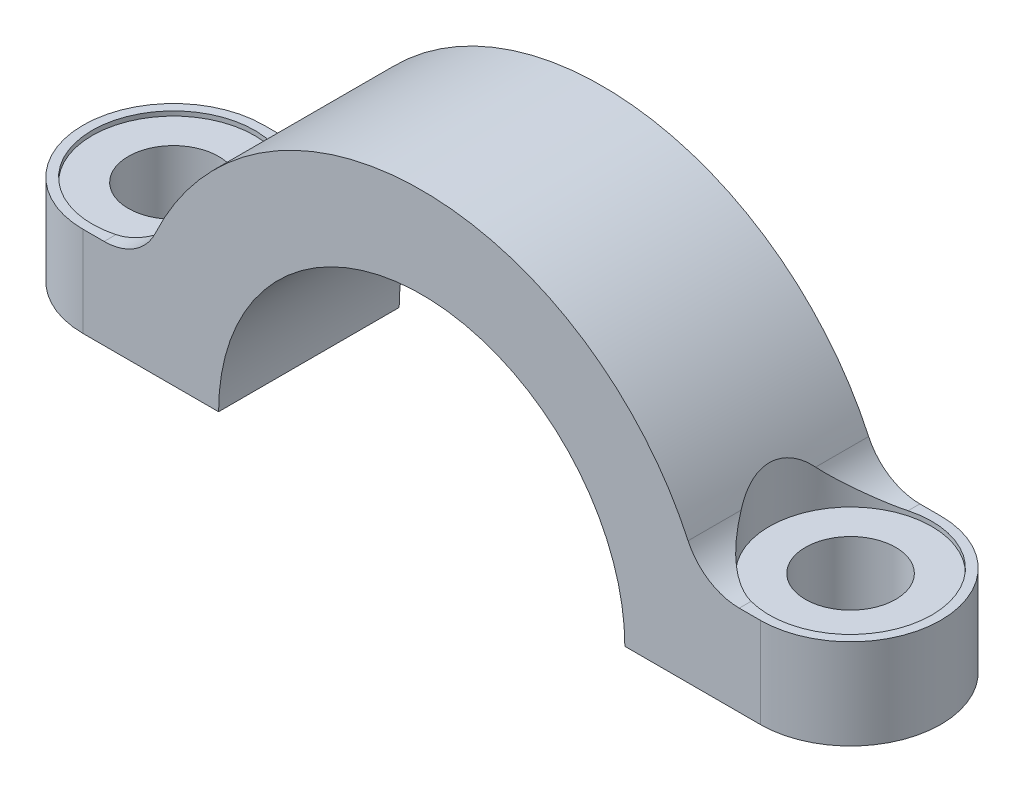
ISO-10303-21;
HEADER;
FILE_DESCRIPTION(('STEP AP214'),'2;1');
FILE_NAME('part.step','',(''),(''),'','','');
FILE_SCHEMA(('AUTOMOTIVE_DESIGN { 1 0 10303 214 1 1 1 1 }'));
ENDSEC;
DATA;
#1=APPLICATION_CONTEXT('core data for automotive mechanical design processes');
#2=APPLICATION_PROTOCOL_DEFINITION('international standard','automotive_design',2000,#1);
#3=PRODUCT_CONTEXT('',#1,'mechanical');
#4=PRODUCT('Part','Part','',(#3));
#5=PRODUCT_RELATED_PRODUCT_CATEGORY('part','',(#4));
#6=PRODUCT_DEFINITION_FORMATION('','',#4);
#7=PRODUCT_DEFINITION_CONTEXT('part definition',#1,'design');
#8=PRODUCT_DEFINITION('design','',#6,#7);
#9=PRODUCT_DEFINITION_SHAPE('','',#8);
#10=(LENGTH_UNIT() NAMED_UNIT(*) SI_UNIT(.MILLI.,.METRE.));
#11=(NAMED_UNIT(*) PLANE_ANGLE_UNIT() SI_UNIT($,.RADIAN.));
#12=(NAMED_UNIT(*) SI_UNIT($,.STERADIAN.) SOLID_ANGLE_UNIT());
#13=UNCERTAINTY_MEASURE_WITH_UNIT(LENGTH_MEASURE(1.E-05),#10,'distance_accuracy_value','');
#14=(GEOMETRIC_REPRESENTATION_CONTEXT(3) GLOBAL_UNCERTAINTY_ASSIGNED_CONTEXT((#13)) GLOBAL_UNIT_ASSIGNED_CONTEXT((#10,
#11,#12)) REPRESENTATION_CONTEXT('',''));
#15=CARTESIAN_POINT('',(0.,0.,0.));
#16=DIRECTION('',(0.,0.,1.));
#17=DIRECTION('',(1.,0.,0.));
#18=AXIS2_PLACEMENT_3D('',#15,#16,#17);
#19=CARTESIAN_POINT('',(14.0712472794703,6.5,4.));
#20=DIRECTION('',(0.,0.,-1.));
#21=DIRECTION('',(-1.,0.,0.));
#22=AXIS2_PLACEMENT_3D('',#19,#20,#21);
#23=CYLINDRICAL_SURFACE('',#22,2.5);
#24=CARTESIAN_POINT('',(11.8016912666525,5.45161290322581,1.65251966590208));
#25=CARTESIAN_POINT('',(11.8188289746263,5.41452420369606,1.68569339481372));
#26=CARTESIAN_POINT('',(11.8367686755661,5.3780649501407,1.71914330040095));
#27=CARTESIAN_POINT('',(11.8742559931517,5.3063196638288,1.78639364698118));
#28=CARTESIAN_POINT('',(11.8938034999538,5.27103355115527,1.82019406388992));
#29=CARTESIAN_POINT('',(11.9548915904636,5.16675750836371,1.92186570037149));
#30=CARTESIAN_POINT('',(11.9988573042518,5.09939392837527,1.98996723746635));
#31=CARTESIAN_POINT('',(12.0937907115289,4.9682446602968,2.12624378968798));
#32=CARTESIAN_POINT('',(12.144819167192,4.90449764120915,2.19441370426769));
#33=CARTESIAN_POINT('',(12.2537120050401,4.78148091019149,2.32925150995005));
#34=CARTESIAN_POINT('',(12.3115741377295,4.72220973538662,2.39591988676887));
#35=CARTESIAN_POINT('',(12.4737368523032,4.57209028407437,2.56899006025771));
#36=CARTESIAN_POINT('',(12.5840339669892,4.48534818048161,2.67347470244523));
#37=CARTESIAN_POINT('',(12.8238677149758,4.32872273657087,2.87203100536795));
#38=CARTESIAN_POINT('',(12.9533455477352,4.25878952732398,2.96613300859957));
#39=CARTESIAN_POINT('',(13.2007259713607,4.15348331978466,3.12074482179419));
#40=CARTESIAN_POINT('',(13.3150405588784,4.11390357215417,3.18411250532935));
#41=CARTESIAN_POINT('',(13.5534866088813,4.0511189168058,3.2992414474127));
#42=CARTESIAN_POINT('',(13.6775916068689,4.02787144143483,3.3510326360635));
#43=CARTESIAN_POINT('',(13.8486925577638,4.00953571992758,3.41125450979519));
#44=CARTESIAN_POINT('',(13.8927666825841,4.00598196212824,3.4258137904709));
#45=CARTESIAN_POINT('',(13.9815577683437,4.0012147374168,3.45324889719051));
#46=CARTESIAN_POINT('',(14.0262746996844,4.00000116309398,3.46612480047348));
#47=CARTESIAN_POINT('',(14.0712472794703,3.9999999999999,3.47813432519632));
#48=B_SPLINE_CURVE_WITH_KNOTS('',3,(#24,#25,#26,#27,#28,#29,#30,#31,#32,#33,#34,#35,#36,#37,#38,
#39,#40,#41,#42,#43,#44,#45,#46,#47),.UNSPECIFIED.,.F.,.F.,(4,2,2,2,2,2,2,2,2,2,2,4),(0.,
0.157860585988416,0.315710396031228,0.631598419231587,0.950395939136866,1.26908880891188,
1.79201855633125,2.31337716780999,2.72156767446074,3.12869030591443,3.26827336571579,
3.40785001872314),.UNSPECIFIED.);
#49=CARTESIAN_POINT('',(11.8016912666525,5.4516129032258,1.65251966590208));
#50=VERTEX_POINT('',#49);
#51=CARTESIAN_POINT('',(14.0712472794703,4.,3.47813432519629));
#52=VERTEX_POINT('',#51);
#53=EDGE_CURVE('E267',#50,#52,#48,.T.);
#54=ORIENTED_EDGE('',*,*,#53,.F.);
#55=DIRECTION('',(0.,0.,-1.));
#56=VECTOR('',#55,1.);
#57=CARTESIAN_POINT('',(11.8016912666525,5.45161290322581,4.));
#58=LINE('',#57,#56);
#59=CARTESIAN_POINT('',(11.8016912666525,5.45161290322581,4.));
#60=VERTEX_POINT('',#59);
#61=EDGE_CURVE('E180',#60,#50,#58,.T.);
#62=ORIENTED_EDGE('',*,*,#61,.F.);
#63=CARTESIAN_POINT('',(14.0712472794703,6.5,4.));
#64=DIRECTION('',(0.,0.,-1.));
#65=DIRECTION('',(1.,0.,0.));
#66=AXIS2_PLACEMENT_3D('',#63,#64,#65);
#67=CIRCLE('',#66,2.5);
#68=CARTESIAN_POINT('',(14.0712472794703,4.,4.));
#69=VERTEX_POINT('',#68);
#70=EDGE_CURVE('E284',#69,#60,#67,.T.);
#71=ORIENTED_EDGE('',*,*,#70,.F.);
#72=DIRECTION('',(0.,0.,-1.));
#73=VECTOR('',#72,1.);
#74=CARTESIAN_POINT('',(14.0712472794703,4.,4.));
#75=LINE('',#74,#73);
#76=EDGE_CURVE('E184',#69,#52,#75,.T.);
#77=ORIENTED_EDGE('',*,*,#76,.T.);
#78=EDGE_LOOP('',(#54,#62,#71,#77));
#79=FACE_BOUND('',#78,.T.);
#80=ADVANCED_FACE('F45',(#79),#23,.F.);
#81=CARTESIAN_POINT('',(14.0712472794703,4.,-3.47813432519629));
#82=CARTESIAN_POINT('',(14.0032319986114,3.9999879130768,-3.45998969483515));
#83=CARTESIAN_POINT('',(13.9357895006218,4.00277469817216,-3.43982717035991));
#84=CARTESIAN_POINT('',(13.8026519717465,4.01357792717883,-3.39576739876573));
#85=CARTESIAN_POINT('',(13.7369548763053,4.02158787740242,-3.3718748170481));
#86=CARTESIAN_POINT('',(13.6083584672097,4.04237095535815,-3.3208554956094));
#87=CARTESIAN_POINT('',(13.5454383602942,4.05509765294117,-3.29376197979606));
#88=CARTESIAN_POINT('',(13.4220903534515,4.0849172375046,-3.23648440923201));
#89=CARTESIAN_POINT('',(13.3616631839194,4.10201139368336,-3.20629945762984));
#90=CARTESIAN_POINT('',(13.1851558289351,4.15904658994398,-3.1119193230719));
#91=CARTESIAN_POINT('',(13.0731106375179,4.20486806637085,-3.04360078764601));
#92=CARTESIAN_POINT('',(12.8608810391779,4.30931925386273,-2.89841713023571));
#93=CARTESIAN_POINT('',(12.7607369051065,4.36799064584802,-2.82152460499326));
#94=CARTESIAN_POINT('',(12.5223184540677,4.52989626190688,-2.61858113899497));
#95=CARTESIAN_POINT('',(12.3923603348274,4.64016461680518,-2.48826401766969));
#96=CARTESIAN_POINT('',(12.2186739464261,4.81925771350425,-2.28738086447931));
#97=CARTESIAN_POINT('',(12.1642914693542,4.88128256303884,-2.21947203744771));
#98=CARTESIAN_POINT('',(12.0623497656172,5.00968338209213,-2.0826586666038));
#99=CARTESIAN_POINT('',(12.0147873287778,5.07605728294693,-2.0137546081673));
#100=CARTESIAN_POINT('',(11.9389915577287,5.19352180296022,-1.89569029426438));
#101=CARTESIAN_POINT('',(11.9091198004615,5.24355638584065,-1.84651759714745));
#102=CARTESIAN_POINT('',(11.8528488763825,5.34584343690724,-1.74889129918759));
#103=CARTESIAN_POINT('',(11.8264385045383,5.39808798609242,-1.70043585231195));
#104=CARTESIAN_POINT('',(11.8016912666525,5.45161290322581,-1.65251966590208));
#105=B_SPLINE_CURVE_WITH_KNOTS('',3,(#81,#82,#83,#84,#85,#86,#87,#88,#89,#90,#91,#92,#93,#94,
#95,#96,#97,#98,#99,#100,#101,#102,#103,#104),.UNSPECIFIED.,.F.,.F.,(4,2,2,2,2,2,2,2,2,2,2,4),
(0.,0.211046299428014,0.421830715012294,0.63059308142513,0.839416184034419,1.25466964164437,
1.67129053834591,2.31111768515722,2.63145367130033,2.95163837770608,3.18027941162569,
3.40816098787586),.UNSPECIFIED.);
#106=CARTESIAN_POINT('',(14.0712472794703,4.,-3.47813432519629));
#107=VERTEX_POINT('',#106);
#108=CARTESIAN_POINT('',(11.8016912666525,5.45161290322581,-1.65251966590208));
#109=VERTEX_POINT('',#108);
#110=EDGE_CURVE('E66',#107,#109,#105,.T.);
#111=ORIENTED_EDGE('',*,*,#110,.F.);
#112=CARTESIAN_POINT('',(14.0712472794703,4.,-4.));
#113=VERTEX_POINT('',#112);
#114=EDGE_CURVE('E183',#107,#113,#75,.T.);
#115=ORIENTED_EDGE('',*,*,#114,.T.);
#116=CARTESIAN_POINT('',(14.0712472794703,6.5,-4.));
#117=DIRECTION('',(0.,0.,-1.));
#118=DIRECTION('',(1.,0.,0.));
#119=AXIS2_PLACEMENT_3D('',#116,#117,#118);
#120=CIRCLE('',#119,2.5);
#121=CARTESIAN_POINT('',(11.8016912666525,5.45161290322581,-4.));
#122=VERTEX_POINT('',#121);
#123=EDGE_CURVE('E302',#113,#122,#120,.T.);
#124=ORIENTED_EDGE('',*,*,#123,.T.);
#125=EDGE_CURVE('E179',#109,#122,#58,.T.);
#126=ORIENTED_EDGE('',*,*,#125,.F.);
#127=EDGE_LOOP('',(#111,#115,#124,#126));
#128=FACE_BOUND('',#127,.T.);
#129=ADVANCED_FACE('F263',(#128),#23,.F.);
#130=CARTESIAN_POINT('',(-14.0712472794703,6.5,4.));
#131=DIRECTION('',(0.,0.,-1.));
#132=DIRECTION('',(-1.,0.,0.));
#133=AXIS2_PLACEMENT_3D('',#130,#131,#132);
#134=CYLINDRICAL_SURFACE('',#133,2.5);
#135=CARTESIAN_POINT('',(-14.0712472794703,4.,3.47813432519629));
#136=CARTESIAN_POINT('',(-14.0032319986114,3.9999879130768,3.45998969483515));
#137=CARTESIAN_POINT('',(-13.9357895006218,4.00277469817216,3.43982717035992));
#138=CARTESIAN_POINT('',(-13.8026519717465,4.01357792717883,3.39576739876573));
#139=CARTESIAN_POINT('',(-13.7369548763053,4.02158787740242,3.3718748170481));
#140=CARTESIAN_POINT('',(-13.6083584672097,4.04237095535814,3.3208554956094));
#141=CARTESIAN_POINT('',(-13.5454383602942,4.05509765294117,3.29376197979606));
#142=CARTESIAN_POINT('',(-13.4220903534515,4.0849172375046,3.23648440923201));
#143=CARTESIAN_POINT('',(-13.3616631839194,4.10201139368336,3.20629945762985));
#144=CARTESIAN_POINT('',(-13.1851558289351,4.15904658994398,3.1119193230719));
#145=CARTESIAN_POINT('',(-13.0731106375179,4.20486806637085,3.04360078764602));
#146=CARTESIAN_POINT('',(-12.8608810391779,4.30931925386273,2.89841713023571));
#147=CARTESIAN_POINT('',(-12.7607369051065,4.36799064584802,2.82152460499327));
#148=CARTESIAN_POINT('',(-12.5223184540677,4.52989626190688,2.61858113899497));
#149=CARTESIAN_POINT('',(-12.3923603348274,4.64016461680518,2.48826401766969));
#150=CARTESIAN_POINT('',(-12.2186739464261,4.81925771350425,2.28738086447932));
#151=CARTESIAN_POINT('',(-12.1642914693542,4.88128256303884,2.21947203744771));
#152=CARTESIAN_POINT('',(-12.0623497656172,5.00968338209213,2.0826586666038));
#153=CARTESIAN_POINT('',(-12.0147873287778,5.07605728294693,2.01375460816731));
#154=CARTESIAN_POINT('',(-11.9389915577287,5.19352180296022,1.89569029426439));
#155=CARTESIAN_POINT('',(-11.9091198004615,5.24355638584065,1.84651759714745));
#156=CARTESIAN_POINT('',(-11.8528488763825,5.34584343690724,1.74889129918759));
#157=CARTESIAN_POINT('',(-11.8264385045383,5.39808798609242,1.70043585231196));
#158=CARTESIAN_POINT('',(-11.8016912666525,5.45161290322581,1.65251966590208));
#159=B_SPLINE_CURVE_WITH_KNOTS('',3,(#135,#136,#137,#138,#139,#140,#141,#142,#143,#144,#145,
#146,#147,#148,#149,#150,#151,#152,#153,#154,#155,#156,#157,#158),.UNSPECIFIED.,.F.,.F.,(4,2,2,
2,2,2,2,2,2,2,2,4),(0.,0.211046299428013,0.421830715012292,0.630593081425127,0.839416184034417,
1.25466964164437,1.67129053834591,2.31111768515721,2.63145367130032,2.95163837770608,
3.18027941162569,3.40816098787586),.UNSPECIFIED.);
#160=CARTESIAN_POINT('',(-14.0712472794703,4.,3.47813432519629));
#161=VERTEX_POINT('',#160);
#162=CARTESIAN_POINT('',(-11.8016912666525,5.45161290322581,1.65251966590208));
#163=VERTEX_POINT('',#162);
#164=EDGE_CURVE('E151',#161,#163,#159,.T.);
#165=ORIENTED_EDGE('',*,*,#164,.F.);
#166=DIRECTION('',(0.,0.,-1.));
#167=VECTOR('',#166,1.);
#168=CARTESIAN_POINT('',(-14.0712472794703,4.,4.));
#169=LINE('',#168,#167);
#170=CARTESIAN_POINT('',(-14.0712472794703,4.,4.));
#171=VERTEX_POINT('',#170);
#172=EDGE_CURVE('E162',#171,#161,#169,.T.);
#173=ORIENTED_EDGE('',*,*,#172,.F.);
#174=CARTESIAN_POINT('',(-14.0712472794703,6.5,4.));
#175=DIRECTION('',(0.,0.,-1.));
#176=DIRECTION('',(1.,0.,0.));
#177=AXIS2_PLACEMENT_3D('',#174,#175,#176);
#178=CIRCLE('',#177,2.5);
#179=CARTESIAN_POINT('',(-11.8016912666525,5.45161290322581,4.));
#180=VERTEX_POINT('',#179);
#181=EDGE_CURVE('E289',#180,#171,#178,.T.);
#182=ORIENTED_EDGE('',*,*,#181,.F.);
#183=DIRECTION('',(0.,0.,-1.));
#184=VECTOR('',#183,1.);
#185=CARTESIAN_POINT('',(-11.8016912666525,5.45161290322581,4.));
#186=LINE('',#185,#184);
#187=EDGE_CURVE('E165',#180,#163,#186,.T.);
#188=ORIENTED_EDGE('',*,*,#187,.T.);
#189=EDGE_LOOP('',(#165,#173,#182,#188));
#190=FACE_BOUND('',#189,.T.);
#191=ADVANCED_FACE('F160',(#190),#134,.F.);
#192=CARTESIAN_POINT('',(-11.8016912666525,5.45161290322581,-1.65251966590208));
#193=CARTESIAN_POINT('',(-11.8188289746263,5.41452420369607,-1.68569339481372));
#194=CARTESIAN_POINT('',(-11.8367686755661,5.3780649501407,-1.71914330040095));
#195=CARTESIAN_POINT('',(-11.8742559931517,5.3063196638288,-1.78639364698118));
#196=CARTESIAN_POINT('',(-11.8938034999538,5.27103355115527,-1.82019406388992));
#197=CARTESIAN_POINT('',(-11.9548915904636,5.16675750836371,-1.92186570037149));
#198=CARTESIAN_POINT('',(-11.9988573042518,5.09939392837527,-1.98996723746635));
#199=CARTESIAN_POINT('',(-12.0937907115289,4.9682446602968,-2.12624378968798));
#200=CARTESIAN_POINT('',(-12.144819167192,4.90449764120915,-2.19441370426769));
#201=CARTESIAN_POINT('',(-12.2537120050401,4.78148091019149,-2.32925150995005));
#202=CARTESIAN_POINT('',(-12.3115741377295,4.72220973538662,-2.39591988676887));
#203=CARTESIAN_POINT('',(-12.4737368523032,4.57209028407437,-2.56899006025771));
#204=CARTESIAN_POINT('',(-12.5840339669892,4.48534818048161,-2.67347470244523));
#205=CARTESIAN_POINT('',(-12.8238677149758,4.32872273657087,-2.87203100536795));
#206=CARTESIAN_POINT('',(-12.9533455477352,4.25878952732398,-2.96613300859957));
#207=CARTESIAN_POINT('',(-13.2007259713607,4.15348331978466,-3.12074482179419));
#208=CARTESIAN_POINT('',(-13.3150405588784,4.11390357215417,-3.18411250532935));
#209=CARTESIAN_POINT('',(-13.5534866088813,4.0511189168058,-3.2992414474127));
#210=CARTESIAN_POINT('',(-13.6775916068689,4.02787144143483,-3.3510326360635));
#211=CARTESIAN_POINT('',(-13.8486925577638,4.00953571992758,-3.4112545097952));
#212=CARTESIAN_POINT('',(-13.8927666825841,4.00598196212824,-3.4258137904709));
#213=CARTESIAN_POINT('',(-13.9815577683437,4.0012147374168,-3.45324889719051));
#214=CARTESIAN_POINT('',(-14.0262746996844,4.00000116309398,-3.46612480047348));
#215=CARTESIAN_POINT('',(-14.0712472794703,3.9999999999999,-3.47813432519633));
#216=B_SPLINE_CURVE_WITH_KNOTS('',3,(#192,#193,#194,#195,#196,#197,#198,#199,#200,#201,#202,
#203,#204,#205,#206,#207,#208,#209,#210,#211,#212,#213,#214,#215),.UNSPECIFIED.,.F.,.F.,(4,2,2,
2,2,2,2,2,2,2,2,4),(0.,0.157860585988415,0.315710396031227,0.631598419231586,0.950395939136866,
1.26908880891188,1.79201855633125,2.31337716780999,2.72156767446074,3.12869030591443,
3.26827336571579,3.40785001872314),.UNSPECIFIED.);
#217=CARTESIAN_POINT('',(-11.8016912666525,5.45161290322581,-1.65251966590208));
#218=VERTEX_POINT('',#217);
#219=CARTESIAN_POINT('',(-14.0712472794703,4.,-3.47813432519629));
#220=VERTEX_POINT('',#219);
#221=EDGE_CURVE('E74',#218,#220,#216,.T.);
#222=ORIENTED_EDGE('',*,*,#221,.F.);
#223=CARTESIAN_POINT('',(-11.8016912666525,5.45161290322581,-4.));
#224=VERTEX_POINT('',#223);
#225=EDGE_CURVE('E171',#218,#224,#186,.T.);
#226=ORIENTED_EDGE('',*,*,#225,.T.);
#227=CARTESIAN_POINT('',(-14.0712472794703,6.5,-4.));
#228=DIRECTION('',(0.,0.,-1.));
#229=DIRECTION('',(1.,0.,0.));
#230=AXIS2_PLACEMENT_3D('',#227,#228,#229);
#231=CIRCLE('',#230,2.5);
#232=CARTESIAN_POINT('',(-14.0712472794703,4.,-4.));
#233=VERTEX_POINT('',#232);
#234=EDGE_CURVE('E308',#224,#233,#231,.T.);
#235=ORIENTED_EDGE('',*,*,#234,.T.);
#236=EDGE_CURVE('E172',#220,#233,#169,.T.);
#237=ORIENTED_EDGE('',*,*,#236,.F.);
#238=EDGE_LOOP('',(#222,#226,#235,#237));
#239=FACE_BOUND('',#238,.T.);
#240=ADVANCED_FACE('F257',(#239),#134,.F.);
#241=CARTESIAN_POINT('',(0.,0.,4.));
#242=DIRECTION('',(0.,0.,-1.));
#243=DIRECTION('',(-1.,0.,0.));
#244=AXIS2_PLACEMENT_3D('',#241,#242,#243);
#245=CYLINDRICAL_SURFACE('',#244,13.);
#246=CARTESIAN_POINT('',(-11.8016912666525,5.45161290322581,1.65251966590208));
#247=CARTESIAN_POINT('',(-11.7619137019363,5.53780814362832,1.57548012476357));
#248=CARTESIAN_POINT('',(-11.7227848091341,5.61994684893184,1.49296699320704));
#249=CARTESIAN_POINT('',(-11.6476849009631,5.77396122889819,1.31582824393827));
#250=CARTESIAN_POINT('',(-11.6117546383982,5.84571022590225,1.22107610769326));
#251=CARTESIAN_POINT('',(-11.5457206433814,5.97509091428311,1.01942726082592));
#252=CARTESIAN_POINT('',(-11.5156530625301,6.03263556078395,0.912461271660977));
#253=CARTESIAN_POINT('',(-11.4646576493945,6.12899752853031,0.688776664422131));
#254=CARTESIAN_POINT('',(-11.443690017605,6.16789647822427,0.572103229712972));
#255=CARTESIAN_POINT('',(-11.4143109780329,6.22209106245833,0.33999052429771));
#256=CARTESIAN_POINT('',(-11.4051657434658,6.23876837591726,0.224972911142451));
#257=CARTESIAN_POINT('',(-11.3981460398666,6.25158677184615,-0.0066183734464122));
#258=CARTESIAN_POINT('',(-11.4002732793139,6.24772474133057,-0.123192278083927));
#259=CARTESIAN_POINT('',(-11.4143437284637,6.22196930548397,-0.3356727430065));
#260=CARTESIAN_POINT('',(-11.4247566357726,6.20288593907618,-0.432042643643419));
#261=CARTESIAN_POINT('',(-11.4525292435083,6.1514570542709,-0.620071207165805));
#262=CARTESIAN_POINT('',(-11.4698892941514,6.11911086727213,-0.711729632275613));
#263=CARTESIAN_POINT('',(-11.5165752297443,6.03089411022247,-0.916499643465016));
#264=CARTESIAN_POINT('',(-11.5479462304932,5.97082766737508,-1.02732801334705));
#265=CARTESIAN_POINT('',(-11.6172389103602,5.83485729068521,-1.23658587435948));
#266=CARTESIAN_POINT('',(-11.6551732479249,5.75892269264222,-1.33499075844268));
#267=CARTESIAN_POINT('',(-11.7121981947765,5.64145297615188,-1.46705598368692));
#268=CARTESIAN_POINT('',(-11.7298034915953,5.60477036893255,-1.50584029634813));
#269=CARTESIAN_POINT('',(-11.7654465758293,5.52955602870316,-1.58094256149348));
#270=CARTESIAN_POINT('',(-11.7834818103125,5.49103427739538,-1.61727170591447));
#271=CARTESIAN_POINT('',(-11.8016912666525,5.45161290322581,-1.65251966590208));
#272=B_SPLINE_CURVE_WITH_KNOTS('',3,(#246,#247,#248,#249,#250,#251,#252,#253,#254,#255,#256,
#257,#258,#259,#260,#261,#262,#263,#264,#265,#266,#267,#268,#269,#270,#271),.UNSPECIFIED.,.F.,
.F.,(4,2,2,2,2,2,2,2,2,2,2,2,4),(0.,0.367165135052669,0.738485813181745,1.11202841753501,
1.48392041698507,1.83140227606247,2.17893680171119,2.47400731495714,2.76909270503727,
3.15669052659331,3.54504439978402,3.71361625158862,3.8813590312099),.UNSPECIFIED.);
#273=EDGE_CURVE('E166',#163,#218,#272,.T.);
#274=ORIENTED_EDGE('',*,*,#273,.F.);
#275=ORIENTED_EDGE('',*,*,#187,.F.);
#276=CARTESIAN_POINT('',(0.,0.,4.));
#277=DIRECTION('',(0.,0.,1.));
#278=DIRECTION('',(1.,0.,0.));
#279=AXIS2_PLACEMENT_3D('',#276,#277,#278);
#280=CIRCLE('',#279,13.);
#281=EDGE_CURVE('E287',#60,#180,#280,.T.);
#282=ORIENTED_EDGE('',*,*,#281,.F.);
#283=ORIENTED_EDGE('',*,*,#61,.T.);
#284=CARTESIAN_POINT('',(11.8016912666525,5.4516129032258,-1.65251966590208));
#285=CARTESIAN_POINT('',(11.7619137019363,5.53780814362832,-1.57548012476357));
#286=CARTESIAN_POINT('',(11.7227848091341,5.61994684893184,-1.49296699320704));
#287=CARTESIAN_POINT('',(11.6476849009631,5.77396122889819,-1.31582824393827));
#288=CARTESIAN_POINT('',(11.6117546383982,5.84571022590224,-1.22107610769326));
#289=CARTESIAN_POINT('',(11.5457206433814,5.97509091428311,-1.01942726082592));
#290=CARTESIAN_POINT('',(11.5156530625301,6.03263556078395,-0.912461271660977));
#291=CARTESIAN_POINT('',(11.4646576493945,6.12899752853031,-0.688776664422133));
#292=CARTESIAN_POINT('',(11.443690017605,6.16789647822427,-0.572103229712974));
#293=CARTESIAN_POINT('',(11.4143109780329,6.22209106245833,-0.339990524297712));
#294=CARTESIAN_POINT('',(11.4051657434658,6.23876837591726,-0.224972911142453));
#295=CARTESIAN_POINT('',(11.3981460398666,6.25158677184615,0.0066183734464108));
#296=CARTESIAN_POINT('',(11.4002732793139,6.24772474133057,0.123192278083926));
#297=CARTESIAN_POINT('',(11.4143437284637,6.22196930548397,0.335672743006499));
#298=CARTESIAN_POINT('',(11.4247566357726,6.20288593907618,0.432042643643418));
#299=CARTESIAN_POINT('',(11.4525292435083,6.1514570542709,0.620071207165804));
#300=CARTESIAN_POINT('',(11.4698892941514,6.11911086727213,0.711729632275611));
#301=CARTESIAN_POINT('',(11.5165752297443,6.03089411022246,0.916499643465014));
#302=CARTESIAN_POINT('',(11.5479462304932,5.97082766737507,1.02732801334705));
#303=CARTESIAN_POINT('',(11.6172389103602,5.83485729068521,1.23658587435947));
#304=CARTESIAN_POINT('',(11.6551732479249,5.75892269264222,1.33499075844267));
#305=CARTESIAN_POINT('',(11.7121981947765,5.64145297615188,1.46705598368691));
#306=CARTESIAN_POINT('',(11.7298034915953,5.60477036893255,1.50584029634812));
#307=CARTESIAN_POINT('',(11.7654465758293,5.52955602870316,1.58094256149348));
#308=CARTESIAN_POINT('',(11.7834818103125,5.49103427739538,1.61727170591447));
#309=CARTESIAN_POINT('',(11.8016912666525,5.4516129032258,1.65251966590208));
#310=B_SPLINE_CURVE_WITH_KNOTS('',3,(#284,#285,#286,#287,#288,#289,#290,#291,#292,#293,#294,
#295,#296,#297,#298,#299,#300,#301,#302,#303,#304,#305,#306,#307,#308,#309),.UNSPECIFIED.,.F.,
.F.,(4,2,2,2,2,2,2,2,2,2,2,2,4),(0.,0.367165135052668,0.738485813181745,1.11202841753501,
1.48392041698507,1.83140227606247,2.17893680171119,2.47400731495714,2.76909270503727,
3.1566905265933,3.54504439978402,3.71361625158862,3.88135903120989),.UNSPECIFIED.);
#311=EDGE_CURVE('E11',#109,#50,#310,.T.);
#312=ORIENTED_EDGE('',*,*,#311,.F.);
#313=ORIENTED_EDGE('',*,*,#125,.T.);
#314=CARTESIAN_POINT('',(0.,0.,-4.));
#315=DIRECTION('',(0.,0.,1.));
#316=DIRECTION('',(1.,0.,0.));
#317=AXIS2_PLACEMENT_3D('',#314,#315,#316);
#318=CIRCLE('',#317,13.);
#319=EDGE_CURVE('E305',#122,#224,#318,.T.);
#320=ORIENTED_EDGE('',*,*,#319,.T.);
#321=ORIENTED_EDGE('',*,*,#225,.F.);
#322=EDGE_LOOP('',(#274,#275,#282,#283,#312,#313,#320,#321));
#323=FACE_BOUND('',#322,.T.);
#324=ADVANCED_FACE('F253',(#323),#245,.T.);
#325=CARTESIAN_POINT('',(15.,13.,0.));
#326=DIRECTION('',(0.,-1.,0.));
#327=DIRECTION('',(0.,0.,-1.));
#328=AXIS2_PLACEMENT_3D('',#325,#326,#327);
#329=CYLINDRICAL_SURFACE('',#328,2.);
#330=CARTESIAN_POINT('',(15.,0.,0.));
#331=DIRECTION('',(0.,1.,0.));
#332=DIRECTION('',(0.,0.,1.));
#333=AXIS2_PLACEMENT_3D('',#330,#331,#332);
#334=CIRCLE('',#333,2.);
#335=CARTESIAN_POINT('',(15.,0.,2.00000000000001));
#336=VERTEX_POINT('',#335);
#337=EDGE_CURVE('E276',#336,#336,#334,.T.);
#338=ORIENTED_EDGE('',*,*,#337,.F.);
#339=EDGE_LOOP('',(#338));
#340=FACE_BOUND('',#339,.T.);
#341=CARTESIAN_POINT('',(15.,3.8,0.));
#342=DIRECTION('',(0.,1.,0.));
#343=DIRECTION('',(0.,0.,1.));
#344=AXIS2_PLACEMENT_3D('',#341,#342,#343);
#345=CIRCLE('',#344,2.);
#346=CARTESIAN_POINT('',(15.,3.8,2.00000000000001));
#347=VERTEX_POINT('',#346);
#348=EDGE_CURVE('E209',#347,#347,#345,.T.);
#349=ORIENTED_EDGE('',*,*,#348,.T.);
#350=EDGE_LOOP('',(#349));
#351=FACE_BOUND('',#350,.T.);
#352=ADVANCED_FACE('F256',(#340,#351),#329,.F.);
#353=CARTESIAN_POINT('',(-15.,13.,0.));
#354=DIRECTION('',(0.,-1.,0.));
#355=DIRECTION('',(0.,0.,-1.));
#356=AXIS2_PLACEMENT_3D('',#353,#354,#355);
#357=CYLINDRICAL_SURFACE('',#356,2.);
#358=CARTESIAN_POINT('',(-15.,0.,0.));
#359=DIRECTION('',(0.,1.,0.));
#360=DIRECTION('',(0.,0.,1.));
#361=AXIS2_PLACEMENT_3D('',#358,#359,#360);
#362=CIRCLE('',#361,2.);
#363=CARTESIAN_POINT('',(-15.,0.,2.));
#364=VERTEX_POINT('',#363);
#365=EDGE_CURVE('E275',#364,#364,#362,.T.);
#366=ORIENTED_EDGE('',*,*,#365,.F.);
#367=EDGE_LOOP('',(#366));
#368=FACE_BOUND('',#367,.T.);
#369=CARTESIAN_POINT('',(-15.,3.8,0.));
#370=DIRECTION('',(0.,1.,0.));
#371=DIRECTION('',(0.,0.,1.));
#372=AXIS2_PLACEMENT_3D('',#369,#370,#371);
#373=CIRCLE('',#372,2.);
#374=CARTESIAN_POINT('',(-15.,3.8,2.));
#375=VERTEX_POINT('',#374);
#376=EDGE_CURVE('E206',#375,#375,#373,.T.);
#377=ORIENTED_EDGE('',*,*,#376,.T.);
#378=EDGE_LOOP('',(#377));
#379=FACE_BOUND('',#378,.T.);
#380=ADVANCED_FACE('F382',(#368,#379),#357,.F.);
#381=CARTESIAN_POINT('',(-15.,0.,0.));
#382=DIRECTION('',(0.,-1.,0.));
#383=DIRECTION('',(0.,0.,-1.));
#384=AXIS2_PLACEMENT_3D('',#381,#382,#383);
#385=CYLINDRICAL_SURFACE('',#384,4.);
#386=DIRECTION('',(0.,-1.,0.));
#387=VECTOR('',#386,1.);
#388=CARTESIAN_POINT('',(-15.,0.,-4.));
#389=LINE('',#388,#387);
#390=CARTESIAN_POINT('',(-15.,0.,-4.));
#391=VERTEX_POINT('',#390);
#392=CARTESIAN_POINT('',(-15.,4.,-4.));
#393=VERTEX_POINT('',#392);
#394=EDGE_CURVE('E197',#391,#393,#389,.F.);
#395=ORIENTED_EDGE('',*,*,#394,.F.);
#396=CARTESIAN_POINT('',(-15.,0.,0.));
#397=DIRECTION('',(0.,1.,0.));
#398=DIRECTION('',(0.,0.,1.));
#399=AXIS2_PLACEMENT_3D('',#396,#397,#398);
#400=CIRCLE('',#399,4.);
#401=CARTESIAN_POINT('',(-15.,0.,4.));
#402=VERTEX_POINT('',#401);
#403=EDGE_CURVE('E203',#402,#391,#400,.F.);
#404=ORIENTED_EDGE('',*,*,#403,.F.);
#405=DIRECTION('',(0.,1.,0.));
#406=VECTOR('',#405,1.);
#407=CARTESIAN_POINT('',(-15.,0.,4.));
#408=LINE('',#407,#406);
#409=CARTESIAN_POINT('',(-15.,4.,4.));
#410=VERTEX_POINT('',#409);
#411=EDGE_CURVE('E200',#410,#402,#408,.F.);
#412=ORIENTED_EDGE('',*,*,#411,.F.);
#413=CARTESIAN_POINT('',(-15.,4.,0.));
#414=DIRECTION('',(0.,-1.,0.));
#415=DIRECTION('',(0.,0.,-1.));
#416=AXIS2_PLACEMENT_3D('',#413,#414,#415);
#417=CIRCLE('',#416,4.);
#418=EDGE_CURVE('E156',#393,#410,#417,.F.);
#419=ORIENTED_EDGE('',*,*,#418,.F.);
#420=EDGE_LOOP('',(#395,#404,#412,#419));
#421=FACE_BOUND('',#420,.T.);
#422=ADVANCED_FACE('F48',(#421),#385,.T.);
#423=CARTESIAN_POINT('',(15.,0.,0.));
#424=DIRECTION('',(0.,1.,0.));
#425=DIRECTION('',(0.,0.,1.));
#426=AXIS2_PLACEMENT_3D('',#423,#424,#425);
#427=CYLINDRICAL_SURFACE('',#426,4.);
#428=DIRECTION('',(0.,-1.,0.));
#429=VECTOR('',#428,1.);
#430=CARTESIAN_POINT('',(15.,0.,4.));
#431=LINE('',#430,#429);
#432=CARTESIAN_POINT('',(15.,0.,4.));
#433=VERTEX_POINT('',#432);
#434=CARTESIAN_POINT('',(15.,4.,4.));
#435=VERTEX_POINT('',#434);
#436=EDGE_CURVE('E187',#433,#435,#431,.F.);
#437=ORIENTED_EDGE('',*,*,#436,.F.);
#438=CARTESIAN_POINT('',(15.,0.,0.));
#439=DIRECTION('',(0.,1.,0.));
#440=DIRECTION('',(0.,0.,1.));
#441=AXIS2_PLACEMENT_3D('',#438,#439,#440);
#442=CIRCLE('',#441,4.);
#443=CARTESIAN_POINT('',(15.,0.,-4.));
#444=VERTEX_POINT('',#443);
#445=EDGE_CURVE('E193',#444,#433,#442,.F.);
#446=ORIENTED_EDGE('',*,*,#445,.F.);
#447=DIRECTION('',(0.,1.,0.));
#448=VECTOR('',#447,1.);
#449=CARTESIAN_POINT('',(15.,0.,-4.));
#450=LINE('',#449,#448);
#451=CARTESIAN_POINT('',(15.,4.,-4.));
#452=VERTEX_POINT('',#451);
#453=EDGE_CURVE('E190',#452,#444,#450,.F.);
#454=ORIENTED_EDGE('',*,*,#453,.F.);
#455=CARTESIAN_POINT('',(15.,4.,0.));
#456=DIRECTION('',(0.,-1.,0.));
#457=DIRECTION('',(0.,0.,-1.));
#458=AXIS2_PLACEMENT_3D('',#455,#456,#457);
#459=CIRCLE('',#458,4.);
#460=EDGE_CURVE('E195',#435,#452,#459,.F.);
#461=ORIENTED_EDGE('',*,*,#460,.F.);
#462=EDGE_LOOP('',(#437,#446,#454,#461));
#463=FACE_BOUND('',#462,.T.);
#464=ADVANCED_FACE('F339',(#463),#427,.T.);
#465=CARTESIAN_POINT('',(14.0712472794703,4.,4.));
#466=DIRECTION('',(0.,-1.,0.));
#467=DIRECTION('',(0.,0.,-1.));
#468=AXIS2_PLACEMENT_3D('',#465,#466,#467);
#469=PLANE('',#468);
#470=CARTESIAN_POINT('',(15.,4.,0.));
#471=DIRECTION('',(0.,-1.,0.));
#472=DIRECTION('',(0.,0.,-1.));
#473=AXIS2_PLACEMENT_3D('',#470,#471,#472);
#474=CIRCLE('',#473,3.6);
#475=EDGE_CURVE('E273',#52,#107,#474,.F.);
#476=ORIENTED_EDGE('',*,*,#475,.F.);
#477=ORIENTED_EDGE('',*,*,#76,.F.);
#478=DIRECTION('',(-1.,0.,0.));
#479=VECTOR('',#478,1.);
#480=CARTESIAN_POINT('',(14.0712472794703,4.,4.));
#481=LINE('',#480,#479);
#482=EDGE_CURVE('E282',#435,#69,#481,.T.);
#483=ORIENTED_EDGE('',*,*,#482,.F.);
#484=ORIENTED_EDGE('',*,*,#460,.T.);
#485=DIRECTION('',(-1.,0.,0.));
#486=VECTOR('',#485,1.);
#487=CARTESIAN_POINT('',(14.0712472794703,4.,-4.));
#488=LINE('',#487,#486);
#489=EDGE_CURVE('E279',#452,#113,#488,.T.);
#490=ORIENTED_EDGE('',*,*,#489,.T.);
#491=ORIENTED_EDGE('',*,*,#114,.F.);
#492=EDGE_LOOP('',(#476,#477,#483,#484,#490,#491));
#493=FACE_BOUND('',#492,.T.);
#494=ADVANCED_FACE('F265',(#493),#469,.F.);
#495=CARTESIAN_POINT('',(-19.,4.,4.));
#496=DIRECTION('',(0.,-1.,0.));
#497=DIRECTION('',(0.,0.,-1.));
#498=AXIS2_PLACEMENT_3D('',#495,#496,#497);
#499=PLANE('',#498);
#500=CARTESIAN_POINT('',(-15.,4.,0.));
#501=DIRECTION('',(0.,-1.,0.));
#502=DIRECTION('',(0.,0.,-1.));
#503=AXIS2_PLACEMENT_3D('',#500,#501,#502);
#504=CIRCLE('',#503,3.6);
#505=EDGE_CURVE('E60',#220,#161,#504,.F.);
#506=ORIENTED_EDGE('',*,*,#505,.F.);
#507=ORIENTED_EDGE('',*,*,#236,.T.);
#508=DIRECTION('',(-1.,0.,0.));
#509=VECTOR('',#508,1.);
#510=CARTESIAN_POINT('',(-19.,4.,-4.));
#511=LINE('',#510,#509);
#512=EDGE_CURVE('E311',#233,#393,#511,.T.);
#513=ORIENTED_EDGE('',*,*,#512,.T.);
#514=ORIENTED_EDGE('',*,*,#418,.T.);
#515=DIRECTION('',(-1.,0.,0.));
#516=VECTOR('',#515,1.);
#517=CARTESIAN_POINT('',(-19.,4.,4.));
#518=LINE('',#517,#516);
#519=EDGE_CURVE('E170',#171,#410,#518,.T.);
#520=ORIENTED_EDGE('',*,*,#519,.F.);
#521=ORIENTED_EDGE('',*,*,#172,.T.);
#522=EDGE_LOOP('',(#506,#507,#513,#514,#520,#521));
#523=FACE_BOUND('',#522,.T.);
#524=ADVANCED_FACE('F168',(#523),#499,.F.);
#525=CARTESIAN_POINT('',(-19.,0.,4.));
#526=DIRECTION('',(0.,1.,0.));
#527=DIRECTION('',(0.,0.,1.));
#528=AXIS2_PLACEMENT_3D('',#525,#526,#527);
#529=PLANE('',#528);
#530=ORIENTED_EDGE('',*,*,#365,.T.);
#531=EDGE_LOOP('',(#530));
#532=FACE_BOUND('',#531,.T.);
#533=DIRECTION('',(1.,0.,0.));
#534=VECTOR('',#533,1.);
#535=CARTESIAN_POINT('',(-19.,0.,4.));
#536=LINE('',#535,#534);
#537=CARTESIAN_POINT('',(-9.,0.,4.));
#538=VERTEX_POINT('',#537);
#539=EDGE_CURVE('E292',#402,#538,#536,.T.);
#540=ORIENTED_EDGE('',*,*,#539,.F.);
#541=ORIENTED_EDGE('',*,*,#403,.T.);
#542=DIRECTION('',(1.,0.,0.));
#543=VECTOR('',#542,1.);
#544=CARTESIAN_POINT('',(-19.,0.,-4.));
#545=LINE('',#544,#543);
#546=CARTESIAN_POINT('',(-9.,0.,-4.));
#547=VERTEX_POINT('',#546);
#548=EDGE_CURVE('E314',#391,#547,#545,.T.);
#549=ORIENTED_EDGE('',*,*,#548,.T.);
#550=DIRECTION('',(0.,0.,-1.));
#551=VECTOR('',#550,1.);
#552=CARTESIAN_POINT('',(-9.,0.,4.));
#553=LINE('',#552,#551);
#554=EDGE_CURVE('E175',#538,#547,#553,.T.);
#555=ORIENTED_EDGE('',*,*,#554,.F.);
#556=EDGE_LOOP('',(#540,#541,#549,#555));
#557=FACE_BOUND('',#556,.T.);
#558=ADVANCED_FACE('F344',(#532,#557),#529,.F.);
#559=CARTESIAN_POINT('',(0.,0.,4.));
#560=DIRECTION('',(0.,0.,-1.));
#561=DIRECTION('',(-1.,0.,0.));
#562=AXIS2_PLACEMENT_3D('',#559,#560,#561);
#563=CYLINDRICAL_SURFACE('',#562,9.);
#564=CARTESIAN_POINT('',(0.,0.,-4.));
#565=DIRECTION('',(0.,0.,-1.));
#566=DIRECTION('',(1.,0.,0.));
#567=AXIS2_PLACEMENT_3D('',#564,#565,#566);
#568=CIRCLE('',#567,9.);
#569=CARTESIAN_POINT('',(9.,0.,-4.));
#570=VERTEX_POINT('',#569);
#571=EDGE_CURVE('E316',#547,#570,#568,.T.);
#572=ORIENTED_EDGE('',*,*,#571,.T.);
#573=DIRECTION('',(0.,0.,-1.));
#574=VECTOR('',#573,1.);
#575=CARTESIAN_POINT('',(9.,0.,4.));
#576=LINE('',#575,#574);
#577=CARTESIAN_POINT('',(9.,0.,4.));
#578=VERTEX_POINT('',#577);
#579=EDGE_CURVE('E299',#578,#570,#576,.T.);
#580=ORIENTED_EDGE('',*,*,#579,.F.);
#581=CARTESIAN_POINT('',(0.,0.,4.));
#582=DIRECTION('',(0.,0.,-1.));
#583=DIRECTION('',(1.,0.,0.));
#584=AXIS2_PLACEMENT_3D('',#581,#582,#583);
#585=CIRCLE('',#584,9.);
#586=EDGE_CURVE('E294',#538,#578,#585,.T.);
#587=ORIENTED_EDGE('',*,*,#586,.F.);
#588=ORIENTED_EDGE('',*,*,#554,.T.);
#589=EDGE_LOOP('',(#572,#580,#587,#588));
#590=FACE_BOUND('',#589,.T.);
#591=ADVANCED_FACE('F329',(#590),#563,.F.);
#592=CARTESIAN_POINT('',(9.,0.,4.));
#593=DIRECTION('',(0.,1.,0.));
#594=DIRECTION('',(0.,0.,1.));
#595=AXIS2_PLACEMENT_3D('',#592,#593,#594);
#596=PLANE('',#595);
#597=ORIENTED_EDGE('',*,*,#337,.T.);
#598=EDGE_LOOP('',(#597));
#599=FACE_BOUND('',#598,.T.);
#600=DIRECTION('',(1.,0.,0.));
#601=VECTOR('',#600,1.);
#602=CARTESIAN_POINT('',(9.,0.,-4.));
#603=LINE('',#602,#601);
#604=EDGE_CURVE('E285',#570,#444,#603,.T.);
#605=ORIENTED_EDGE('',*,*,#604,.T.);
#606=ORIENTED_EDGE('',*,*,#445,.T.);
#607=DIRECTION('',(1.,0.,0.));
#608=VECTOR('',#607,1.);
#609=CARTESIAN_POINT('',(9.,0.,4.));
#610=LINE('',#609,#608);
#611=EDGE_CURVE('E296',#578,#433,#610,.T.);
#612=ORIENTED_EDGE('',*,*,#611,.F.);
#613=ORIENTED_EDGE('',*,*,#579,.T.);
#614=EDGE_LOOP('',(#605,#606,#612,#613));
#615=FACE_BOUND('',#614,.T.);
#616=ADVANCED_FACE('F336',(#599,#615),#596,.F.);
#617=CARTESIAN_POINT('',(0.,0.,4.));
#618=DIRECTION('',(0.,0.,1.));
#619=DIRECTION('',(1.,0.,0.));
#620=AXIS2_PLACEMENT_3D('',#617,#618,#619);
#621=PLANE('',#620);
#622=ORIENTED_EDGE('',*,*,#519,.T.);
#623=ORIENTED_EDGE('',*,*,#411,.T.);
#624=ORIENTED_EDGE('',*,*,#539,.T.);
#625=ORIENTED_EDGE('',*,*,#586,.T.);
#626=ORIENTED_EDGE('',*,*,#611,.T.);
#627=ORIENTED_EDGE('',*,*,#436,.T.);
#628=ORIENTED_EDGE('',*,*,#482,.T.);
#629=ORIENTED_EDGE('',*,*,#70,.T.);
#630=ORIENTED_EDGE('',*,*,#281,.T.);
#631=ORIENTED_EDGE('',*,*,#181,.T.);
#632=EDGE_LOOP('',(#622,#623,#624,#625,#626,#627,#628,#629,#630,#631));
#633=FACE_BOUND('',#632,.T.);
#634=ADVANCED_FACE('F342',(#633),#621,.T.);
#635=CARTESIAN_POINT('',(0.,0.,-4.));
#636=DIRECTION('',(0.,0.,1.));
#637=DIRECTION('',(1.,0.,0.));
#638=AXIS2_PLACEMENT_3D('',#635,#636,#637);
#639=PLANE('',#638);
#640=ORIENTED_EDGE('',*,*,#548,.F.);
#641=ORIENTED_EDGE('',*,*,#394,.T.);
#642=ORIENTED_EDGE('',*,*,#512,.F.);
#643=ORIENTED_EDGE('',*,*,#234,.F.);
#644=ORIENTED_EDGE('',*,*,#319,.F.);
#645=ORIENTED_EDGE('',*,*,#123,.F.);
#646=ORIENTED_EDGE('',*,*,#489,.F.);
#647=ORIENTED_EDGE('',*,*,#453,.T.);
#648=ORIENTED_EDGE('',*,*,#604,.F.);
#649=ORIENTED_EDGE('',*,*,#571,.F.);
#650=EDGE_LOOP('',(#640,#641,#642,#643,#644,#645,#646,#647,#648,#649));
#651=FACE_BOUND('',#650,.T.);
#652=ADVANCED_FACE('F235',(#651),#639,.F.);
#653=CARTESIAN_POINT('',(-15.,13.,0.));
#654=DIRECTION('',(0.,-1.,0.));
#655=DIRECTION('',(0.,0.,-1.));
#656=AXIS2_PLACEMENT_3D('',#653,#654,#655);
#657=CYLINDRICAL_SURFACE('',#656,3.6);
#658=CARTESIAN_POINT('',(-15.,3.8,0.));
#659=DIRECTION('',(0.,1.,0.));
#660=DIRECTION('',(0.,0.,1.));
#661=AXIS2_PLACEMENT_3D('',#658,#659,#660);
#662=CIRCLE('',#661,3.6);
#663=CARTESIAN_POINT('',(-15.,3.8,3.6));
#664=VERTEX_POINT('',#663);
#665=EDGE_CURVE('E210',#664,#664,#662,.T.);
#666=ORIENTED_EDGE('',*,*,#665,.F.);
#667=EDGE_LOOP('',(#666));
#668=FACE_BOUND('',#667,.T.);
#669=ORIENTED_EDGE('',*,*,#273,.T.);
#670=ORIENTED_EDGE('',*,*,#221,.T.);
#671=ORIENTED_EDGE('',*,*,#505,.T.);
#672=ORIENTED_EDGE('',*,*,#164,.T.);
#673=EDGE_LOOP('',(#669,#670,#671,#672));
#674=FACE_BOUND('',#673,.T.);
#675=ADVANCED_FACE('F150',(#668,#674),#657,.F.);
#676=CARTESIAN_POINT('',(-15.,3.8,0.));
#677=DIRECTION('',(0.,1.,0.));
#678=DIRECTION('',(0.,0.,1.));
#679=AXIS2_PLACEMENT_3D('',#676,#677,#678);
#680=PLANE('',#679);
#681=ORIENTED_EDGE('',*,*,#376,.F.);
#682=EDGE_LOOP('',(#681));
#683=FACE_BOUND('',#682,.T.);
#684=ORIENTED_EDGE('',*,*,#665,.T.);
#685=EDGE_LOOP('',(#684));
#686=FACE_BOUND('',#685,.T.);
#687=ADVANCED_FACE('F234',(#683,#686),#680,.T.);
#688=CARTESIAN_POINT('',(15.,13.,0.));
#689=DIRECTION('',(0.,-1.,0.));
#690=DIRECTION('',(0.,0.,-1.));
#691=AXIS2_PLACEMENT_3D('',#688,#689,#690);
#692=CYLINDRICAL_SURFACE('',#691,3.6);
#693=CARTESIAN_POINT('',(15.,3.8,0.));
#694=DIRECTION('',(0.,1.,0.));
#695=DIRECTION('',(0.,0.,1.));
#696=AXIS2_PLACEMENT_3D('',#693,#694,#695);
#697=CIRCLE('',#696,3.6);
#698=CARTESIAN_POINT('',(15.,3.8,3.6));
#699=VERTEX_POINT('',#698);
#700=EDGE_CURVE('E222',#699,#699,#697,.T.);
#701=ORIENTED_EDGE('',*,*,#700,.F.);
#702=EDGE_LOOP('',(#701));
#703=FACE_BOUND('',#702,.T.);
#704=ORIENTED_EDGE('',*,*,#475,.T.);
#705=ORIENTED_EDGE('',*,*,#110,.T.);
#706=ORIENTED_EDGE('',*,*,#311,.T.);
#707=ORIENTED_EDGE('',*,*,#53,.T.);
#708=EDGE_LOOP('',(#704,#705,#706,#707));
#709=FACE_BOUND('',#708,.T.);
#710=ADVANCED_FACE('F237',(#703,#709),#692,.F.);
#711=CARTESIAN_POINT('',(15.,3.8,0.));
#712=DIRECTION('',(0.,1.,0.));
#713=DIRECTION('',(0.,0.,1.));
#714=AXIS2_PLACEMENT_3D('',#711,#712,#713);
#715=PLANE('',#714);
#716=ORIENTED_EDGE('',*,*,#348,.F.);
#717=EDGE_LOOP('',(#716));
#718=FACE_BOUND('',#717,.T.);
#719=ORIENTED_EDGE('',*,*,#700,.T.);
#720=EDGE_LOOP('',(#719));
#721=FACE_BOUND('',#720,.T.);
#722=ADVANCED_FACE('F364',(#718,#721),#715,.T.);
#723=CLOSED_SHELL('',(#80,#129,#191,#240,#324,#352,#380,#422,#464,#494,#524,#558,#591,#616,#634,
#652,#675,#687,#710,#722));
#724=MANIFOLD_SOLID_BREP('B2',#723);
#725=ADVANCED_BREP_SHAPE_REPRESENTATION('',(#18,#724),#14);
#726=SHAPE_DEFINITION_REPRESENTATION(#9,#725);
ENDSEC;
END-ISO-10303-21;
